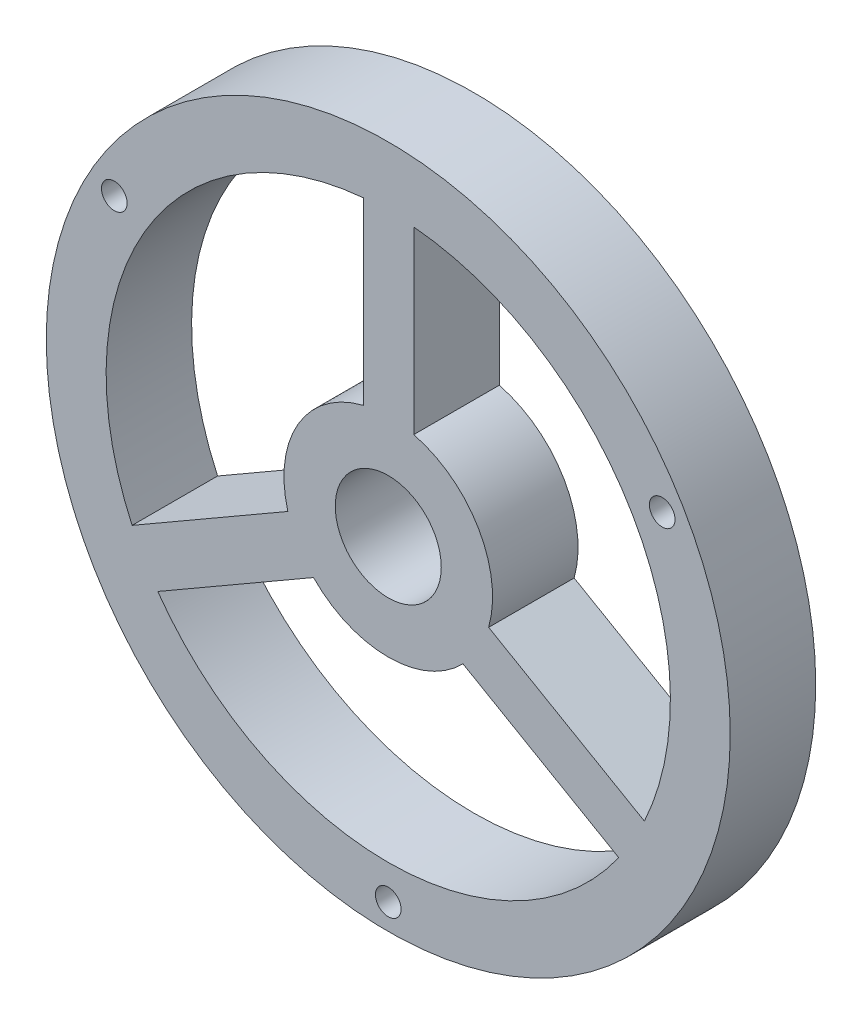
ISO-10303-21;
HEADER;
FILE_DESCRIPTION(('STEP AP214'),'2;1');
FILE_NAME('part.step','',(''),(''),'','','');
FILE_SCHEMA(('AUTOMOTIVE_DESIGN { 1 0 10303 214 1 1 1 1 }'));
ENDSEC;
DATA;
#1=APPLICATION_CONTEXT('core data for automotive mechanical design processes');
#2=APPLICATION_PROTOCOL_DEFINITION('international standard','automotive_design',2000,#1);
#3=PRODUCT_CONTEXT('',#1,'mechanical');
#4=PRODUCT('Part','Part','',(#3));
#5=PRODUCT_RELATED_PRODUCT_CATEGORY('part','',(#4));
#6=PRODUCT_DEFINITION_FORMATION('','',#4);
#7=PRODUCT_DEFINITION_CONTEXT('part definition',#1,'design');
#8=PRODUCT_DEFINITION('design','',#6,#7);
#9=PRODUCT_DEFINITION_SHAPE('','',#8);
#10=(LENGTH_UNIT() NAMED_UNIT(*) SI_UNIT(.MILLI.,.METRE.));
#11=(NAMED_UNIT(*) PLANE_ANGLE_UNIT() SI_UNIT($,.RADIAN.));
#12=(NAMED_UNIT(*) SI_UNIT($,.STERADIAN.) SOLID_ANGLE_UNIT());
#13=UNCERTAINTY_MEASURE_WITH_UNIT(LENGTH_MEASURE(1.E-05),#10,'distance_accuracy_value','');
#14=(GEOMETRIC_REPRESENTATION_CONTEXT(3) GLOBAL_UNCERTAINTY_ASSIGNED_CONTEXT((#13)) GLOBAL_UNIT_ASSIGNED_CONTEXT((#10,
#11,#12)) REPRESENTATION_CONTEXT('',''));
#15=CARTESIAN_POINT('',(0.,0.,0.));
#16=DIRECTION('',(0.,0.,1.));
#17=DIRECTION('',(1.,0.,0.));
#18=AXIS2_PLACEMENT_3D('',#15,#16,#17);
#19=CARTESIAN_POINT('',(48.2964743549606,27.9249074552953,5.));
#20=DIRECTION('',(0.,0.,-1.));
#21=DIRECTION('',(-1.,0.,0.));
#22=AXIS2_PLACEMENT_3D('',#19,#20,#21);
#23=CYLINDRICAL_SURFACE('',#22,16.5);
#24=CARTESIAN_POINT('',(48.2964743549606,27.9249074552953,0.));
#25=DIRECTION('',(0.,0.,1.));
#26=DIRECTION('',(1.,0.,0.));
#27=AXIS2_PLACEMENT_3D('',#24,#25,#26);
#28=CIRCLE('',#27,16.5);
#29=CARTESIAN_POINT('',(63.2767238257183,21.0081071983944,0.));
#30=VERTEX_POINT('',#29);
#31=CARTESIAN_POINT('',(49.7879309777147,44.3573618411271,0.));
#32=VERTEX_POINT('',#31);
#33=EDGE_CURVE('E215',#30,#32,#28,.T.);
#34=ORIENTED_EDGE('',*,*,#33,.F.);
#35=DIRECTION('',(0.,0.,-1.));
#36=VECTOR('',#35,1.);
#37=CARTESIAN_POINT('',(63.2767238257183,21.0081071983944,5.));
#38=LINE('',#37,#36);
#39=CARTESIAN_POINT('',(63.2767238257183,21.0081071983944,5.));
#40=VERTEX_POINT('',#39);
#41=EDGE_CURVE('E11',#40,#30,#38,.T.);
#42=ORIENTED_EDGE('',*,*,#41,.F.);
#43=CARTESIAN_POINT('',(48.2964743549606,27.9249074552953,5.));
#44=DIRECTION('',(0.,0.,1.));
#45=DIRECTION('',(1.,0.,0.));
#46=AXIS2_PLACEMENT_3D('',#43,#44,#45);
#47=CIRCLE('',#46,16.5);
#48=CARTESIAN_POINT('',(49.7879309777147,44.3573618411271,5.));
#49=VERTEX_POINT('',#48);
#50=EDGE_CURVE('E147',#40,#49,#47,.T.);
#51=ORIENTED_EDGE('',*,*,#50,.T.);
#52=DIRECTION('',(0.,0.,-1.));
#53=VECTOR('',#52,1.);
#54=CARTESIAN_POINT('',(49.7879309777147,44.3573618411271,5.));
#55=LINE('',#54,#53);
#56=EDGE_CURVE('E54',#49,#32,#55,.T.);
#57=ORIENTED_EDGE('',*,*,#56,.T.);
#58=EDGE_LOOP('',(#34,#42,#51,#57));
#59=FACE_BOUND('',#58,.T.);
#60=ADVANCED_FACE('F35',(#59),#23,.F.);
#61=CARTESIAN_POINT('',(24.9159582160477,43.1557055494579,5.));
#62=DIRECTION('',(-0.5,-0.866025403784439,0.));
#63=DIRECTION('',(0.866025403784439,-0.5,0.));
#64=AXIS2_PLACEMENT_3D('',#61,#62,#63);
#65=PLANE('',#64);
#66=DIRECTION('',(-0.866025403784439,0.5,0.));
#67=VECTOR('',#66,1.);
#68=CARTESIAN_POINT('',(24.9159582160477,43.1557055494579,0.));
#69=LINE('',#68,#67);
#70=CARTESIAN_POINT('',(54.1670212007574,26.267596461153,0.));
#71=VERTEX_POINT('',#70);
#72=EDGE_CURVE('E152',#30,#71,#69,.T.);
#73=ORIENTED_EDGE('',*,*,#72,.T.);
#74=DIRECTION('',(0.,0.,-1.));
#75=VECTOR('',#74,1.);
#76=CARTESIAN_POINT('',(54.1670212007574,26.267596461153,5.));
#77=LINE('',#76,#75);
#78=CARTESIAN_POINT('',(54.1670212007574,26.267596461153,5.));
#79=VERTEX_POINT('',#78);
#80=EDGE_CURVE('E45',#79,#71,#77,.T.);
#81=ORIENTED_EDGE('',*,*,#80,.F.);
#82=DIRECTION('',(-0.866025403784439,0.5,0.));
#83=VECTOR('',#82,1.);
#84=CARTESIAN_POINT('',(24.9159582160477,43.1557055494579,5.));
#85=LINE('',#84,#83);
#86=EDGE_CURVE('E139',#40,#79,#85,.T.);
#87=ORIENTED_EDGE('',*,*,#86,.F.);
#88=ORIENTED_EDGE('',*,*,#41,.T.);
#89=EDGE_LOOP('',(#73,#81,#87,#88));
#90=FACE_BOUND('',#89,.T.);
#91=ADVANCED_FACE('F150',(#90),#65,.F.);
#92=CARTESIAN_POINT('',(48.2964743549606,27.9249074552953,5.));
#93=DIRECTION('',(0.,0.,-1.));
#94=DIRECTION('',(-1.,0.,0.));
#95=AXIS2_PLACEMENT_3D('',#92,#93,#94);
#96=CYLINDRICAL_SURFACE('',#95,6.1);
#97=CARTESIAN_POINT('',(48.2964743549606,27.9249074552953,0.));
#98=DIRECTION('',(0.,0.,1.));
#99=DIRECTION('',(1.,0.,0.));
#100=AXIS2_PLACEMENT_3D('',#97,#98,#99);
#101=CIRCLE('',#100,6.1);
#102=CARTESIAN_POINT('',(49.7879309777147,33.8397664681918,0.));
#103=VERTEX_POINT('',#102);
#104=EDGE_CURVE('E191',#71,#103,#101,.T.);
#105=ORIENTED_EDGE('',*,*,#104,.T.);
#106=DIRECTION('',(0.,0.,-1.));
#107=VECTOR('',#106,1.);
#108=CARTESIAN_POINT('',(49.7879309777147,33.8397664681918,5.));
#109=LINE('',#108,#107);
#110=CARTESIAN_POINT('',(49.7879309777147,33.8397664681918,5.));
#111=VERTEX_POINT('',#110);
#112=EDGE_CURVE('E92',#111,#103,#109,.T.);
#113=ORIENTED_EDGE('',*,*,#112,.F.);
#114=CARTESIAN_POINT('',(48.2964743549606,27.9249074552953,5.));
#115=DIRECTION('',(0.,0.,1.));
#116=DIRECTION('',(1.,0.,0.));
#117=AXIS2_PLACEMENT_3D('',#114,#115,#116);
#118=CIRCLE('',#117,6.1);
#119=EDGE_CURVE('E131',#79,#111,#118,.T.);
#120=ORIENTED_EDGE('',*,*,#119,.F.);
#121=ORIENTED_EDGE('',*,*,#80,.T.);
#122=EDGE_LOOP('',(#105,#113,#120,#121));
#123=FACE_BOUND('',#122,.T.);
#124=ADVANCED_FACE('F133',(#123),#96,.T.);
#125=CARTESIAN_POINT('',(46.8483422096142,33.8505224689132,0.));
#126=VERTEX_POINT('',#125);
#127=CARTESIAN_POINT('',(42.4259275091637,26.267596461153,0.));
#128=VERTEX_POINT('',#127);
#129=EDGE_CURVE('E192',#126,#128,#101,.T.);
#130=ORIENTED_EDGE('',*,*,#129,.T.);
#131=DIRECTION('',(0.,0.,-1.));
#132=VECTOR('',#131,1.);
#133=CARTESIAN_POINT('',(42.4259275091637,26.267596461153,5.));
#134=LINE('',#133,#132);
#135=CARTESIAN_POINT('',(42.4259275091637,26.267596461153,5.));
#136=VERTEX_POINT('',#135);
#137=EDGE_CURVE('E164',#136,#128,#134,.T.);
#138=ORIENTED_EDGE('',*,*,#137,.F.);
#139=CARTESIAN_POINT('',(46.8483422096142,33.8505224689132,5.));
#140=VERTEX_POINT('',#139);
#141=EDGE_CURVE('E141',#140,#136,#118,.T.);
#142=ORIENTED_EDGE('',*,*,#141,.F.);
#143=DIRECTION('',(0.,0.,-1.));
#144=VECTOR('',#143,1.);
#145=CARTESIAN_POINT('',(46.8483422096142,33.8505224689132,5.));
#146=LINE('',#145,#144);
#147=EDGE_CURVE('E157',#140,#126,#146,.T.);
#148=ORIENTED_EDGE('',*,*,#147,.T.);
#149=EDGE_LOOP('',(#130,#138,#142,#148));
#150=FACE_BOUND('',#149,.T.);
#151=ADVANCED_FACE('F292',(#150),#96,.T.);
#152=CARTESIAN_POINT('',(-0.767721038567435,1.32973184483834,5.));
#153=DIRECTION('',(-0.5,0.866025403784438,0.));
#154=DIRECTION('',(-0.866025403784438,-0.5,0.));
#155=AXIS2_PLACEMENT_3D('',#152,#153,#154);
#156=PLANE('',#155);
#157=DIRECTION('',(0.866025403784439,0.5,0.));
#158=VECTOR('',#157,1.);
#159=CARTESIAN_POINT('',(-0.767721038567435,1.32973184483834,0.));
#160=LINE('',#159,#158);
#161=CARTESIAN_POINT('',(33.3162248842029,21.0081071983944,0.));
#162=VERTEX_POINT('',#161);
#163=EDGE_CURVE('E204',#162,#128,#160,.T.);
#164=ORIENTED_EDGE('',*,*,#163,.F.);
#165=DIRECTION('',(0.,0.,-1.));
#166=VECTOR('',#165,1.);
#167=CARTESIAN_POINT('',(33.3162248842029,21.0081071983944,5.));
#168=LINE('',#167,#166);
#169=CARTESIAN_POINT('',(33.3162248842029,21.0081071983944,5.));
#170=VERTEX_POINT('',#169);
#171=EDGE_CURVE('E162',#170,#162,#168,.T.);
#172=ORIENTED_EDGE('',*,*,#171,.F.);
#173=DIRECTION('',(0.866025403784439,0.5,0.));
#174=VECTOR('',#173,1.);
#175=CARTESIAN_POINT('',(-0.767721038567435,1.32973184483834,5.));
#176=LINE('',#175,#174);
#177=EDGE_CURVE('E237',#170,#136,#176,.T.);
#178=ORIENTED_EDGE('',*,*,#177,.T.);
#179=ORIENTED_EDGE('',*,*,#137,.T.);
#180=EDGE_LOOP('',(#164,#172,#178,#179));
#181=FACE_BOUND('',#180,.T.);
#182=ADVANCED_FACE('F288',(#181),#156,.T.);
#183=CARTESIAN_POINT('',(48.2964743549606,27.9249074552953,5.));
#184=DIRECTION('',(0.,0.,-1.));
#185=DIRECTION('',(-1.,0.,0.));
#186=AXIS2_PLACEMENT_3D('',#183,#184,#185);
#187=CYLINDRICAL_SURFACE('',#186,16.5);
#188=CARTESIAN_POINT('',(48.2964743549606,27.9249074552953,0.));
#189=DIRECTION('',(0.,0.,1.));
#190=DIRECTION('',(1.,0.,0.));
#191=AXIS2_PLACEMENT_3D('',#188,#189,#190);
#192=CIRCLE('',#191,16.5);
#193=CARTESIAN_POINT('',(46.8483422096142,44.3612365250607,0.));
#194=VERTEX_POINT('',#193);
#195=EDGE_CURVE('E207',#194,#162,#192,.T.);
#196=ORIENTED_EDGE('',*,*,#195,.F.);
#197=DIRECTION('',(0.,0.,-1.));
#198=VECTOR('',#197,1.);
#199=CARTESIAN_POINT('',(46.8483422096142,44.3612365250607,5.));
#200=LINE('',#199,#198);
#201=CARTESIAN_POINT('',(46.8483422096142,44.3612365250607,5.));
#202=VERTEX_POINT('',#201);
#203=EDGE_CURVE('E160',#202,#194,#200,.T.);
#204=ORIENTED_EDGE('',*,*,#203,.F.);
#205=CARTESIAN_POINT('',(48.2964743549606,27.9249074552953,5.));
#206=DIRECTION('',(0.,0.,1.));
#207=DIRECTION('',(1.,0.,0.));
#208=AXIS2_PLACEMENT_3D('',#205,#206,#207);
#209=CIRCLE('',#208,16.5);
#210=EDGE_CURVE('E240',#202,#170,#209,.T.);
#211=ORIENTED_EDGE('',*,*,#210,.T.);
#212=ORIENTED_EDGE('',*,*,#171,.T.);
#213=EDGE_LOOP('',(#196,#204,#211,#212));
#214=FACE_BOUND('',#213,.T.);
#215=ADVANCED_FACE('F285',(#214),#187,.F.);
#216=CARTESIAN_POINT('',(0.732278961432563,-1.26834436651497,5.));
#217=DIRECTION('',(0.5,-0.866025403784439,0.));
#218=DIRECTION('',(0.866025403784439,0.5,0.));
#219=AXIS2_PLACEMENT_3D('',#216,#217,#218);
#220=PLANE('',#219);
#221=DIRECTION('',(-0.866025403784439,-0.5,0.));
#222=VECTOR('',#221,1.);
#223=CARTESIAN_POINT('',(0.732278961432563,-1.26834436651497,0.));
#224=LINE('',#223,#222);
#225=CARTESIAN_POINT('',(43.9259275091637,23.6695202497997,0.));
#226=VERTEX_POINT('',#225);
#227=CARTESIAN_POINT('',(34.8162248842029,18.4100309870411,0.));
#228=VERTEX_POINT('',#227);
#229=EDGE_CURVE('E187',#226,#228,#224,.T.);
#230=ORIENTED_EDGE('',*,*,#229,.F.);
#231=DIRECTION('',(0.,0.,-1.));
#232=VECTOR('',#231,1.);
#233=CARTESIAN_POINT('',(43.9259275091637,23.6695202497997,5.));
#234=LINE('',#233,#232);
#235=CARTESIAN_POINT('',(43.9259275091637,23.6695202497997,5.));
#236=VERTEX_POINT('',#235);
#237=EDGE_CURVE('E39',#236,#226,#234,.T.);
#238=ORIENTED_EDGE('',*,*,#237,.F.);
#239=DIRECTION('',(-0.866025403784439,-0.5,0.));
#240=VECTOR('',#239,1.);
#241=CARTESIAN_POINT('',(0.732278961432563,-1.26834436651497,5.));
#242=LINE('',#241,#240);
#243=CARTESIAN_POINT('',(34.8162248842029,18.4100309870411,5.));
#244=VERTEX_POINT('',#243);
#245=EDGE_CURVE('E223',#236,#244,#242,.T.);
#246=ORIENTED_EDGE('',*,*,#245,.T.);
#247=DIRECTION('',(0.,0.,-1.));
#248=VECTOR('',#247,1.);
#249=CARTESIAN_POINT('',(34.8162248842029,18.4100309870411,5.));
#250=LINE('',#249,#248);
#251=EDGE_CURVE('E166',#244,#228,#250,.T.);
#252=ORIENTED_EDGE('',*,*,#251,.T.);
#253=EDGE_LOOP('',(#230,#238,#246,#252));
#254=FACE_BOUND('',#253,.T.);
#255=ADVANCED_FACE('F37',(#254),#220,.T.);
#256=CARTESIAN_POINT('',(52.6670212007574,23.6695202497997,0.));
#257=VERTEX_POINT('',#256);
#258=EDGE_CURVE('E180',#226,#257,#101,.T.);
#259=ORIENTED_EDGE('',*,*,#258,.T.);
#260=DIRECTION('',(0.,0.,-1.));
#261=VECTOR('',#260,1.);
#262=CARTESIAN_POINT('',(52.6670212007574,23.6695202497997,5.));
#263=LINE('',#262,#261);
#264=CARTESIAN_POINT('',(52.6670212007574,23.6695202497997,5.));
#265=VERTEX_POINT('',#264);
#266=EDGE_CURVE('E170',#265,#257,#263,.T.);
#267=ORIENTED_EDGE('',*,*,#266,.F.);
#268=EDGE_CURVE('E142',#236,#265,#118,.T.);
#269=ORIENTED_EDGE('',*,*,#268,.F.);
#270=ORIENTED_EDGE('',*,*,#237,.T.);
#271=EDGE_LOOP('',(#259,#267,#269,#270));
#272=FACE_BOUND('',#271,.T.);
#273=ADVANCED_FACE('F179',(#272),#96,.T.);
#274=CARTESIAN_POINT('',(23.4159582160477,40.5576293381045,5.));
#275=DIRECTION('',(0.5,0.866025403784439,0.));
#276=DIRECTION('',(-0.866025403784439,0.5,0.));
#277=AXIS2_PLACEMENT_3D('',#274,#275,#276);
#278=PLANE('',#277);
#279=DIRECTION('',(0.866025403784439,-0.5,0.));
#280=VECTOR('',#279,1.);
#281=CARTESIAN_POINT('',(23.4159582160477,40.5576293381045,0.));
#282=LINE('',#281,#280);
#283=CARTESIAN_POINT('',(61.7767238257183,18.4100309870411,0.));
#284=VERTEX_POINT('',#283);
#285=EDGE_CURVE('E189',#257,#284,#282,.T.);
#286=ORIENTED_EDGE('',*,*,#285,.T.);
#287=DIRECTION('',(0.,0.,-1.));
#288=VECTOR('',#287,1.);
#289=CARTESIAN_POINT('',(61.7767238257183,18.4100309870411,5.));
#290=LINE('',#289,#288);
#291=CARTESIAN_POINT('',(61.7767238257183,18.4100309870411,5.));
#292=VERTEX_POINT('',#291);
#293=EDGE_CURVE('E168',#292,#284,#290,.T.);
#294=ORIENTED_EDGE('',*,*,#293,.F.);
#295=DIRECTION('',(0.866025403784439,-0.5,0.));
#296=VECTOR('',#295,1.);
#297=CARTESIAN_POINT('',(23.4159582160477,40.5576293381045,5.));
#298=LINE('',#297,#296);
#299=EDGE_CURVE('E228',#265,#292,#298,.T.);
#300=ORIENTED_EDGE('',*,*,#299,.F.);
#301=ORIENTED_EDGE('',*,*,#266,.T.);
#302=EDGE_LOOP('',(#286,#294,#300,#301));
#303=FACE_BOUND('',#302,.T.);
#304=ADVANCED_FACE('F296',(#303),#278,.F.);
#305=CARTESIAN_POINT('',(49.7879309777147,0.,5.));
#306=DIRECTION('',(1.,0.,0.));
#307=DIRECTION('',(0.,1.,0.));
#308=AXIS2_PLACEMENT_3D('',#305,#306,#307);
#309=PLANE('',#308);
#310=DIRECTION('',(0.,-1.,0.));
#311=VECTOR('',#310,1.);
#312=CARTESIAN_POINT('',(49.7879309777147,0.,0.));
#313=LINE('',#312,#311);
#314=EDGE_CURVE('E218',#32,#103,#313,.T.);
#315=ORIENTED_EDGE('',*,*,#314,.F.);
#316=ORIENTED_EDGE('',*,*,#56,.F.);
#317=DIRECTION('',(0.,-1.,0.));
#318=VECTOR('',#317,1.);
#319=CARTESIAN_POINT('',(49.7879309777147,0.,5.));
#320=LINE('',#319,#318);
#321=EDGE_CURVE('E138',#49,#111,#320,.T.);
#322=ORIENTED_EDGE('',*,*,#321,.T.);
#323=ORIENTED_EDGE('',*,*,#112,.T.);
#324=EDGE_LOOP('',(#315,#316,#322,#323));
#325=FACE_BOUND('',#324,.T.);
#326=ADVANCED_FACE('F280',(#325),#309,.T.);
#327=CARTESIAN_POINT('',(48.2964743549606,27.9249074552953,5.));
#328=DIRECTION('',(0.,0.,-1.));
#329=DIRECTION('',(-1.,0.,0.));
#330=AXIS2_PLACEMENT_3D('',#327,#328,#329);
#331=CYLINDRICAL_SURFACE('',#330,20.);
#332=CARTESIAN_POINT('',(48.2964743549606,27.9249074552953,5.));
#333=DIRECTION('',(0.,0.,1.));
#334=DIRECTION('',(1.,0.,0.));
#335=AXIS2_PLACEMENT_3D('',#332,#333,#334);
#336=CIRCLE('',#335,20.);
#337=CARTESIAN_POINT('',(68.2964743549606,27.9249074552953,5.));
#338=VERTEX_POINT('',#337);
#339=EDGE_CURVE('E245',#338,#338,#336,.T.);
#340=ORIENTED_EDGE('',*,*,#339,.F.);
#341=EDGE_LOOP('',(#340));
#342=FACE_BOUND('',#341,.T.);
#343=CARTESIAN_POINT('',(48.2964743549606,27.9249074552953,0.));
#344=DIRECTION('',(0.,0.,1.));
#345=DIRECTION('',(1.,0.,0.));
#346=AXIS2_PLACEMENT_3D('',#343,#344,#345);
#347=CIRCLE('',#346,20.);
#348=CARTESIAN_POINT('',(68.2964743549606,27.9249074552953,0.));
#349=VERTEX_POINT('',#348);
#350=EDGE_CURVE('E212',#349,#349,#347,.T.);
#351=ORIENTED_EDGE('',*,*,#350,.T.);
#352=EDGE_LOOP('',(#351));
#353=FACE_BOUND('',#352,.T.);
#354=ADVANCED_FACE('F276',(#342,#353),#331,.T.);
#355=CARTESIAN_POINT('',(46.8483422096142,0.,5.));
#356=DIRECTION('',(1.,0.,0.));
#357=DIRECTION('',(0.,1.,0.));
#358=AXIS2_PLACEMENT_3D('',#355,#356,#357);
#359=PLANE('',#358);
#360=DIRECTION('',(0.,-1.,0.));
#361=VECTOR('',#360,1.);
#362=CARTESIAN_POINT('',(46.8483422096142,0.,0.));
#363=LINE('',#362,#361);
#364=EDGE_CURVE('E210',#194,#126,#363,.T.);
#365=ORIENTED_EDGE('',*,*,#364,.T.);
#366=ORIENTED_EDGE('',*,*,#147,.F.);
#367=DIRECTION('',(0.,-1.,0.));
#368=VECTOR('',#367,1.);
#369=CARTESIAN_POINT('',(46.8483422096142,0.,5.));
#370=LINE('',#369,#368);
#371=EDGE_CURVE('E243',#202,#140,#370,.T.);
#372=ORIENTED_EDGE('',*,*,#371,.F.);
#373=ORIENTED_EDGE('',*,*,#203,.T.);
#374=EDGE_LOOP('',(#365,#366,#372,#373));
#375=FACE_BOUND('',#374,.T.);
#376=ADVANCED_FACE('F279',(#375),#359,.F.);
#377=CARTESIAN_POINT('',(48.2964743549606,27.9249074552953,5.));
#378=DIRECTION('',(0.,0.,-1.));
#379=DIRECTION('',(-1.,0.,0.));
#380=AXIS2_PLACEMENT_3D('',#377,#378,#379);
#381=CYLINDRICAL_SURFACE('',#380,16.5);
#382=CARTESIAN_POINT('',(48.2964743549606,27.9249074552953,0.));
#383=DIRECTION('',(0.,0.,1.));
#384=DIRECTION('',(1.,0.,0.));
#385=AXIS2_PLACEMENT_3D('',#382,#383,#384);
#386=CIRCLE('',#385,16.5);
#387=EDGE_CURVE('E202',#228,#284,#386,.T.);
#388=ORIENTED_EDGE('',*,*,#387,.F.);
#389=ORIENTED_EDGE('',*,*,#251,.F.);
#390=CARTESIAN_POINT('',(48.2964743549606,27.9249074552953,5.));
#391=DIRECTION('',(0.,0.,1.));
#392=DIRECTION('',(1.,0.,0.));
#393=AXIS2_PLACEMENT_3D('',#390,#391,#392);
#394=CIRCLE('',#393,16.5);
#395=EDGE_CURVE('E234',#244,#292,#394,.T.);
#396=ORIENTED_EDGE('',*,*,#395,.T.);
#397=ORIENTED_EDGE('',*,*,#293,.T.);
#398=EDGE_LOOP('',(#388,#389,#396,#397));
#399=FACE_BOUND('',#398,.T.);
#400=ADVANCED_FACE('F263',(#399),#381,.F.);
#401=CARTESIAN_POINT('',(48.2964743549606,27.9249074552953,5.));
#402=DIRECTION('',(0.,0.,-1.));
#403=DIRECTION('',(-1.,0.,0.));
#404=AXIS2_PLACEMENT_3D('',#401,#402,#403);
#405=CYLINDRICAL_SURFACE('',#404,3.1);
#406=CARTESIAN_POINT('',(48.2964743549606,27.9249074552953,5.));
#407=DIRECTION('',(0.,0.,1.));
#408=DIRECTION('',(1.,0.,0.));
#409=AXIS2_PLACEMENT_3D('',#406,#407,#408);
#410=CIRCLE('',#409,3.1);
#411=CARTESIAN_POINT('',(51.3964743549606,27.9249074552953,5.));
#412=VERTEX_POINT('',#411);
#413=EDGE_CURVE('E169',#412,#412,#410,.T.);
#414=ORIENTED_EDGE('',*,*,#413,.T.);
#415=EDGE_LOOP('',(#414));
#416=FACE_BOUND('',#415,.T.);
#417=CARTESIAN_POINT('',(48.2964743549606,27.9249074552953,0.));
#418=DIRECTION('',(0.,0.,1.));
#419=DIRECTION('',(1.,0.,0.));
#420=AXIS2_PLACEMENT_3D('',#417,#418,#419);
#421=CIRCLE('',#420,3.1);
#422=CARTESIAN_POINT('',(51.3964743549606,27.9249074552953,0.));
#423=VERTEX_POINT('',#422);
#424=EDGE_CURVE('E221',#423,#423,#421,.T.);
#425=ORIENTED_EDGE('',*,*,#424,.F.);
#426=EDGE_LOOP('',(#425));
#427=FACE_BOUND('',#426,.T.);
#428=ADVANCED_FACE('F251',(#416,#427),#405,.F.);
#429=CARTESIAN_POINT('',(0.,0.,5.));
#430=DIRECTION('',(0.,0.,1.));
#431=DIRECTION('',(1.,0.,0.));
#432=AXIS2_PLACEMENT_3D('',#429,#430,#431);
#433=PLANE('',#432);
#434=CARTESIAN_POINT('',(32.2750043849485,37.1749074552953,5.));
#435=DIRECTION('',(0.,0.,1.));
#436=DIRECTION('',(1.,0.,0.));
#437=AXIS2_PLACEMENT_3D('',#434,#435,#436);
#438=CIRCLE('',#437,0.749999999999999);
#439=CARTESIAN_POINT('',(33.0250043849485,37.1749074552953,5.));
#440=VERTEX_POINT('',#439);
#441=EDGE_CURVE('E196',#440,#440,#438,.T.);
#442=ORIENTED_EDGE('',*,*,#441,.F.);
#443=EDGE_LOOP('',(#442));
#444=FACE_BOUND('',#443,.T.);
#445=CARTESIAN_POINT('',(48.2964743549606,9.42490745529527,5.));
#446=DIRECTION('',(0.,0.,1.));
#447=DIRECTION('',(1.,0.,0.));
#448=AXIS2_PLACEMENT_3D('',#445,#446,#447);
#449=CIRCLE('',#448,0.749999999999999);
#450=CARTESIAN_POINT('',(49.0464743549606,9.42490745529527,5.));
#451=VERTEX_POINT('',#450);
#452=EDGE_CURVE('E508',#451,#451,#449,.T.);
#453=ORIENTED_EDGE('',*,*,#452,.F.);
#454=EDGE_LOOP('',(#453));
#455=FACE_BOUND('',#454,.T.);
#456=CARTESIAN_POINT('',(64.3179443249727,37.1749074552953,5.));
#457=DIRECTION('',(0.,0.,1.));
#458=DIRECTION('',(1.,0.,0.));
#459=AXIS2_PLACEMENT_3D('',#456,#457,#458);
#460=CIRCLE('',#459,0.749999999999999);
#461=CARTESIAN_POINT('',(65.0679443249727,37.1749074552953,5.));
#462=VERTEX_POINT('',#461);
#463=EDGE_CURVE('E230',#462,#462,#460,.T.);
#464=ORIENTED_EDGE('',*,*,#463,.F.);
#465=EDGE_LOOP('',(#464));
#466=FACE_BOUND('',#465,.T.);
#467=ORIENTED_EDGE('',*,*,#245,.F.);
#468=ORIENTED_EDGE('',*,*,#268,.T.);
#469=ORIENTED_EDGE('',*,*,#299,.T.);
#470=ORIENTED_EDGE('',*,*,#395,.F.);
#471=EDGE_LOOP('',(#467,#468,#469,#470));
#472=FACE_BOUND('',#471,.T.);
#473=ORIENTED_EDGE('',*,*,#141,.T.);
#474=ORIENTED_EDGE('',*,*,#177,.F.);
#475=ORIENTED_EDGE('',*,*,#210,.F.);
#476=ORIENTED_EDGE('',*,*,#371,.T.);
#477=EDGE_LOOP('',(#473,#474,#475,#476));
#478=FACE_BOUND('',#477,.T.);
#479=ORIENTED_EDGE('',*,*,#339,.T.);
#480=EDGE_LOOP('',(#479));
#481=FACE_BOUND('',#480,.T.);
#482=ORIENTED_EDGE('',*,*,#50,.F.);
#483=ORIENTED_EDGE('',*,*,#86,.T.);
#484=ORIENTED_EDGE('',*,*,#119,.T.);
#485=ORIENTED_EDGE('',*,*,#321,.F.);
#486=EDGE_LOOP('',(#482,#483,#484,#485));
#487=FACE_BOUND('',#486,.T.);
#488=ORIENTED_EDGE('',*,*,#413,.F.);
#489=EDGE_LOOP('',(#488));
#490=FACE_BOUND('',#489,.T.);
#491=ADVANCED_FACE('F145',(#444,#455,#466,#472,#478,#481,#487,#490),#433,.T.);
#492=CARTESIAN_POINT('',(0.,0.,0.));
#493=DIRECTION('',(0.,0.,1.));
#494=DIRECTION('',(1.,0.,0.));
#495=AXIS2_PLACEMENT_3D('',#492,#493,#494);
#496=PLANE('',#495);
#497=CARTESIAN_POINT('',(32.2750043849485,37.1749074552953,0.));
#498=DIRECTION('',(0.,0.,1.));
#499=DIRECTION('',(1.,0.,0.));
#500=AXIS2_PLACEMENT_3D('',#497,#498,#499);
#501=CIRCLE('',#500,0.749999999999999);
#502=CARTESIAN_POINT('',(33.0250043849485,37.1749074552953,0.));
#503=VERTEX_POINT('',#502);
#504=EDGE_CURVE('E193',#503,#503,#501,.T.);
#505=ORIENTED_EDGE('',*,*,#504,.T.);
#506=EDGE_LOOP('',(#505));
#507=FACE_BOUND('',#506,.T.);
#508=CARTESIAN_POINT('',(48.2964743549606,9.42490745529527,0.));
#509=DIRECTION('',(0.,0.,1.));
#510=DIRECTION('',(1.,0.,0.));
#511=AXIS2_PLACEMENT_3D('',#508,#509,#510);
#512=CIRCLE('',#511,0.749999999999999);
#513=CARTESIAN_POINT('',(49.0464743549606,9.42490745529527,0.));
#514=VERTEX_POINT('',#513);
#515=EDGE_CURVE('E505',#514,#514,#512,.T.);
#516=ORIENTED_EDGE('',*,*,#515,.T.);
#517=EDGE_LOOP('',(#516));
#518=FACE_BOUND('',#517,.T.);
#519=CARTESIAN_POINT('',(64.3179443249727,37.1749074552953,0.));
#520=DIRECTION('',(0.,0.,1.));
#521=DIRECTION('',(1.,0.,0.));
#522=AXIS2_PLACEMENT_3D('',#519,#520,#521);
#523=CIRCLE('',#522,0.749999999999999);
#524=CARTESIAN_POINT('',(65.0679443249727,37.1749074552953,0.));
#525=VERTEX_POINT('',#524);
#526=EDGE_CURVE('E512',#525,#525,#523,.T.);
#527=ORIENTED_EDGE('',*,*,#526,.T.);
#528=EDGE_LOOP('',(#527));
#529=FACE_BOUND('',#528,.T.);
#530=ORIENTED_EDGE('',*,*,#229,.T.);
#531=ORIENTED_EDGE('',*,*,#387,.T.);
#532=ORIENTED_EDGE('',*,*,#285,.F.);
#533=ORIENTED_EDGE('',*,*,#258,.F.);
#534=EDGE_LOOP('',(#530,#531,#532,#533));
#535=FACE_BOUND('',#534,.T.);
#536=ORIENTED_EDGE('',*,*,#129,.F.);
#537=ORIENTED_EDGE('',*,*,#364,.F.);
#538=ORIENTED_EDGE('',*,*,#195,.T.);
#539=ORIENTED_EDGE('',*,*,#163,.T.);
#540=EDGE_LOOP('',(#536,#537,#538,#539));
#541=FACE_BOUND('',#540,.T.);
#542=ORIENTED_EDGE('',*,*,#350,.F.);
#543=EDGE_LOOP('',(#542));
#544=FACE_BOUND('',#543,.T.);
#545=ORIENTED_EDGE('',*,*,#33,.T.);
#546=ORIENTED_EDGE('',*,*,#314,.T.);
#547=ORIENTED_EDGE('',*,*,#104,.F.);
#548=ORIENTED_EDGE('',*,*,#72,.F.);
#549=EDGE_LOOP('',(#545,#546,#547,#548));
#550=FACE_BOUND('',#549,.T.);
#551=ORIENTED_EDGE('',*,*,#424,.T.);
#552=EDGE_LOOP('',(#551));
#553=FACE_BOUND('',#552,.T.);
#554=ADVANCED_FACE('F184',(#507,#518,#529,#535,#541,#544,#550,#553),#496,.F.);
#555=CARTESIAN_POINT('',(64.3179443249727,37.1749074552953,0.));
#556=DIRECTION('',(0.,0.,1.));
#557=DIRECTION('',(1.,0.,0.));
#558=AXIS2_PLACEMENT_3D('',#555,#556,#557);
#559=CYLINDRICAL_SURFACE('',#558,0.749999999999999);
#560=ORIENTED_EDGE('',*,*,#526,.F.);
#561=EDGE_LOOP('',(#560));
#562=FACE_BOUND('',#561,.T.);
#563=ORIENTED_EDGE('',*,*,#463,.T.);
#564=EDGE_LOOP('',(#563));
#565=FACE_BOUND('',#564,.T.);
#566=ADVANCED_FACE('F260',(#562,#565),#559,.F.);
#567=CARTESIAN_POINT('',(48.2964743549606,9.42490745529527,0.));
#568=DIRECTION('',(0.,0.,1.));
#569=DIRECTION('',(1.,0.,0.));
#570=AXIS2_PLACEMENT_3D('',#567,#568,#569);
#571=CYLINDRICAL_SURFACE('',#570,0.749999999999999);
#572=ORIENTED_EDGE('',*,*,#515,.F.);
#573=EDGE_LOOP('',(#572));
#574=FACE_BOUND('',#573,.T.);
#575=ORIENTED_EDGE('',*,*,#452,.T.);
#576=EDGE_LOOP('',(#575));
#577=FACE_BOUND('',#576,.T.);
#578=ADVANCED_FACE('F479',(#574,#577),#571,.F.);
#579=CARTESIAN_POINT('',(32.2750043849485,37.1749074552953,0.));
#580=DIRECTION('',(0.,0.,1.));
#581=DIRECTION('',(1.,0.,0.));
#582=AXIS2_PLACEMENT_3D('',#579,#580,#581);
#583=CYLINDRICAL_SURFACE('',#582,0.749999999999999);
#584=ORIENTED_EDGE('',*,*,#504,.F.);
#585=EDGE_LOOP('',(#584));
#586=FACE_BOUND('',#585,.T.);
#587=ORIENTED_EDGE('',*,*,#441,.T.);
#588=EDGE_LOOP('',(#587));
#589=FACE_BOUND('',#588,.T.);
#590=ADVANCED_FACE('F487',(#586,#589),#583,.F.);
#591=CLOSED_SHELL('',(#60,#91,#124,#151,#182,#215,#255,#273,#304,#326,#354,#376,#400,#428,#491,
#554,#566,#578,#590));
#592=MANIFOLD_SOLID_BREP('B2',#591);
#593=ADVANCED_BREP_SHAPE_REPRESENTATION('',(#18,#592),#14);
#594=SHAPE_DEFINITION_REPRESENTATION(#9,#593);
ENDSEC;
END-ISO-10303-21;
